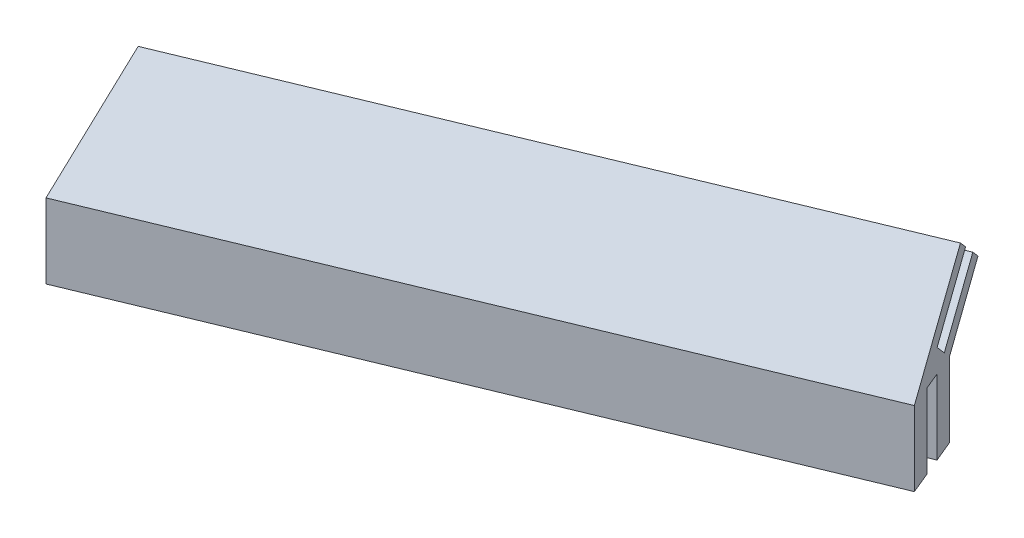
ISO-10303-21;
HEADER;
FILE_DESCRIPTION(('STEP AP214'),'2;1');
FILE_NAME('part.step','',(''),(''),'','','');
FILE_SCHEMA(('AUTOMOTIVE_DESIGN { 1 0 10303 214 1 1 1 1 }'));
ENDSEC;
DATA;
#1=APPLICATION_CONTEXT('core data for automotive mechanical design processes');
#2=APPLICATION_PROTOCOL_DEFINITION('international standard','automotive_design',2000,#1);
#3=PRODUCT_CONTEXT('',#1,'mechanical');
#4=PRODUCT('Part','Part','',(#3));
#5=PRODUCT_RELATED_PRODUCT_CATEGORY('part','',(#4));
#6=PRODUCT_DEFINITION_FORMATION('','',#4);
#7=PRODUCT_DEFINITION_CONTEXT('part definition',#1,'design');
#8=PRODUCT_DEFINITION('design','',#6,#7);
#9=PRODUCT_DEFINITION_SHAPE('','',#8);
#10=(LENGTH_UNIT() NAMED_UNIT(*) SI_UNIT(.MILLI.,.METRE.));
#11=(NAMED_UNIT(*) PLANE_ANGLE_UNIT() SI_UNIT($,.RADIAN.));
#12=(NAMED_UNIT(*) SI_UNIT($,.STERADIAN.) SOLID_ANGLE_UNIT());
#13=UNCERTAINTY_MEASURE_WITH_UNIT(LENGTH_MEASURE(1.E-05),#10,'distance_accuracy_value','');
#14=(GEOMETRIC_REPRESENTATION_CONTEXT(3) GLOBAL_UNCERTAINTY_ASSIGNED_CONTEXT((#13)) GLOBAL_UNIT_ASSIGNED_CONTEXT((#10,
#11,#12)) REPRESENTATION_CONTEXT('',''));
#15=CARTESIAN_POINT('',(0.,0.,0.));
#16=DIRECTION('',(0.,0.,1.));
#17=DIRECTION('',(1.,0.,0.));
#18=AXIS2_PLACEMENT_3D('',#15,#16,#17);
#19=CARTESIAN_POINT('',(-10.3545673524431,20.8540890912135,208.181611462975));
#20=DIRECTION('',(-0.270598050073099,-0.707106781186545,-0.65328148243819));
#21=DIRECTION('',(0.,0.678598344545849,-0.734509555267753));
#22=AXIS2_PLACEMENT_3D('',#19,#20,#21);
#23=PLANE('',#22);
#24=DIRECTION('',(0.,-0.678598344545849,0.734509555267754));
#25=VECTOR('',#24,1.);
#26=CARTESIAN_POINT('',(-2.22449580092777,23.8060509890975,201.618845029443));
#27=LINE('',#26,#25);
#28=CARTESIAN_POINT('',(-2.22449580092764,20.8540890912135,204.814025563273));
#29=VERTEX_POINT('',#28);
#30=CARTESIAN_POINT('',(-2.22449580092776,11.6617009357884,214.763794804766));
#31=VERTEX_POINT('',#30);
#32=EDGE_CURVE('E60',#29,#31,#27,.T.);
#33=ORIENTED_EDGE('',*,*,#32,.T.);
#34=DIRECTION('',(0.923879532511287,0.,-0.38268343236509));
#35=VECTOR('',#34,1.);
#36=CARTESIAN_POINT('',(-6.83679270149283,11.6617009357884,216.674270734671));
#37=LINE('',#36,#35);
#38=CARTESIAN_POINT('',(100.207968635436,11.6617009357884,172.334878807924));
#39=VERTEX_POINT('',#38);
#40=EDGE_CURVE('E245',#31,#39,#37,.T.);
#41=ORIENTED_EDGE('',*,*,#40,.T.);
#42=DIRECTION('',(-0.270598050073099,0.70710678118655,-0.653281482438186));
#43=VECTOR('',#42,1.);
#44=CARTESIAN_POINT('',(96.6901939844858,20.8540890912135,163.842219536228));
#45=LINE('',#44,#43);
#46=CARTESIAN_POINT('',(96.6901939844858,20.8540890912135,163.842219536228));
#47=VERTEX_POINT('',#46);
#48=EDGE_CURVE('E232',#39,#47,#45,.T.);
#49=ORIENTED_EDGE('',*,*,#48,.T.);
#50=DIRECTION('',(0.923879532511287,0.,-0.38268343236509));
#51=VECTOR('',#50,1.);
#52=CARTESIAN_POINT('',(-10.3545673524431,20.8540890912135,208.181611462975));
#53=LINE('',#52,#51);
#54=EDGE_CURVE('E55',#29,#47,#53,.T.);
#55=ORIENTED_EDGE('',*,*,#54,.F.);
#56=EDGE_LOOP('',(#33,#41,#49,#55));
#57=FACE_BOUND('',#56,.T.);
#58=ADVANCED_FACE('F39',(#57),#23,.F.);
#59=CARTESIAN_POINT('',(-6.83679270149283,11.6617009357884,216.674270734671));
#60=DIRECTION('',(0.270598050073097,-0.707106781186552,0.653281482438184));
#61=DIRECTION('',(0.,-0.678598344545842,-0.73450955526776));
#62=AXIS2_PLACEMENT_3D('',#59,#60,#61);
#63=PLANE('',#62);
#64=DIRECTION('',(-0.270598050073102,-0.707106781186543,-0.653281482438191));
#65=VECTOR('',#64,1.);
#66=CARTESIAN_POINT('',(-2.22449580092777,11.6617009357883,214.763794804766));
#67=LINE('',#66,#65);
#68=CARTESIAN_POINT('',(-1.33414524340857,13.9882990642116,216.913291195995));
#69=VERTEX_POINT('',#68);
#70=EDGE_CURVE('E332',#69,#31,#67,.T.);
#71=ORIENTED_EDGE('',*,*,#70,.F.);
#72=DIRECTION('',(0.923879532511287,0.,-0.38268343236509));
#73=VECTOR('',#72,1.);
#74=CARTESIAN_POINT('',(-5.94644214397365,13.9882990642116,218.8237671259));
#75=LINE('',#74,#73);
#76=CARTESIAN_POINT('',(101.098319192955,13.9882990642116,174.484375199153));
#77=VERTEX_POINT('',#76);
#78=EDGE_CURVE('E149',#69,#77,#75,.T.);
#79=ORIENTED_EDGE('',*,*,#78,.T.);
#80=DIRECTION('',(-0.270598050073096,-0.707106781186543,-0.653281482438195));
#81=VECTOR('',#80,1.);
#82=CARTESIAN_POINT('',(100.207968635436,11.6617009357884,172.334878807924));
#83=LINE('',#82,#81);
#84=EDGE_CURVE('E228',#77,#39,#83,.T.);
#85=ORIENTED_EDGE('',*,*,#84,.T.);
#86=ORIENTED_EDGE('',*,*,#40,.F.);
#87=EDGE_LOOP('',(#71,#79,#85,#86));
#88=FACE_BOUND('',#87,.T.);
#89=ADVANCED_FACE('F331',(#88),#63,.F.);
#90=CARTESIAN_POINT('',(-5.94644214397365,13.9882990642116,218.8237671259));
#91=DIRECTION('',(0.270598050073099,0.707106781186547,0.653281482438189));
#92=DIRECTION('',(0.,-0.678598344545848,0.734509555267755));
#93=AXIS2_PLACEMENT_3D('',#90,#91,#92);
#94=PLANE('',#93);
#95=DIRECTION('',(0.,-0.678598344545849,0.734509555267754));
#96=VECTOR('',#95,1.);
#97=CARTESIAN_POINT('',(-1.33414524340857,26.1326491175207,203.768341420673));
#98=LINE('',#97,#96);
#99=CARTESIAN_POINT('',(-1.33414524340857,23.1806872196367,206.963521954503));
#100=VERTEX_POINT('',#99);
#101=EDGE_CURVE('E154',#100,#69,#98,.T.);
#102=ORIENTED_EDGE('',*,*,#101,.F.);
#103=DIRECTION('',(0.923879532511287,0.,-0.38268343236509));
#104=VECTOR('',#103,1.);
#105=CARTESIAN_POINT('',(-9.46421679492393,23.1806872196367,210.331107854204));
#106=LINE('',#105,#104);
#107=CARTESIAN_POINT('',(97.580544542005,23.1806872196367,165.991715927457));
#108=VERTEX_POINT('',#107);
#109=EDGE_CURVE('E138',#100,#108,#106,.T.);
#110=ORIENTED_EDGE('',*,*,#109,.T.);
#111=DIRECTION('',(0.270598050073098,-0.707106781186548,0.653281482438188));
#112=VECTOR('',#111,1.);
#113=CARTESIAN_POINT('',(101.098319192955,13.9882990642116,174.484375199153));
#114=LINE('',#113,#112);
#115=EDGE_CURVE('E225',#108,#77,#114,.T.);
#116=ORIENTED_EDGE('',*,*,#115,.T.);
#117=ORIENTED_EDGE('',*,*,#78,.F.);
#118=EDGE_LOOP('',(#102,#110,#116,#117));
#119=FACE_BOUND('',#118,.T.);
#120=ADVANCED_FACE('F155',(#119),#94,.F.);
#121=CARTESIAN_POINT('',(-13.972297336363,38.284271247462,187.216606807487));
#122=DIRECTION('',(0.2705980500731,0.707106781186546,0.653281482438189));
#123=DIRECTION('',(0.,-0.678598344545848,0.734509555267754));
#124=AXIS2_PLACEMENT_3D('',#121,#122,#123);
#125=PLANE('',#124);
#126=DIRECTION('',(0.,0.678598344545848,-0.734509555267754));
#127=VECTOR('',#126,1.);
#128=CARTESIAN_POINT('',(-3.14837533343908,-8.0485775527046,232.883505674435));
#129=LINE('',#128,#127);
#130=CARTESIAN_POINT('',(-3.14837533343908,10.,213.347866105015));
#131=VERTEX_POINT('',#130);
#132=CARTESIAN_POINT('',(-3.14837533343908,19.1923881554251,203.398096863522));
#133=VERTEX_POINT('',#132);
#134=EDGE_CURVE('E259',#131,#133,#129,.T.);
#135=ORIENTED_EDGE('',*,*,#134,.T.);
#136=DIRECTION('',(0.923879532511287,0.,-0.38268343236509));
#137=VECTOR('',#136,1.);
#138=CARTESIAN_POINT('',(-10.9904727701149,19.1923881554251,206.646399979245));
#139=LINE('',#138,#137);
#140=CARTESIAN_POINT('',(96.054288566814,19.1923881554251,162.307008052498));
#141=VERTEX_POINT('',#140);
#142=EDGE_CURVE('E238',#133,#141,#139,.T.);
#143=ORIENTED_EDGE('',*,*,#142,.T.);
#144=DIRECTION('',(0.270598050073098,-0.707106781186549,0.653281482438187));
#145=VECTOR('',#144,1.);
#146=CARTESIAN_POINT('',(88.7481412148404,38.284271247462,144.668408026667));
#147=LINE('',#146,#145);
#148=CARTESIAN_POINT('',(99.5720632177643,10.,170.799667324194));
#149=VERTEX_POINT('',#148);
#150=EDGE_CURVE('E277',#141,#149,#147,.T.);
#151=ORIENTED_EDGE('',*,*,#150,.T.);
#152=DIRECTION('',(-0.923879532511287,0.,0.382683432365091));
#153=VECTOR('',#152,1.);
#154=CARTESIAN_POINT('',(-3.14837533343908,10.,213.347866105015));
#155=LINE('',#154,#153);
#156=EDGE_CURVE('E266',#149,#131,#155,.T.);
#157=ORIENTED_EDGE('',*,*,#156,.T.);
#158=EDGE_LOOP('',(#135,#143,#151,#157));
#159=FACE_BOUND('',#158,.T.);
#160=ADVANCED_FACE('F326',(#159),#125,.F.);
#161=CARTESIAN_POINT('',(93.0724640005659,38.284271247462,155.108246744044));
#162=DIRECTION('',(-0.270598050073099,-0.707106781186546,-0.653281482438189));
#163=DIRECTION('',(0.,0.678598344545848,-0.734509555267754));
#164=AXIS2_PLACEMENT_3D('',#161,#162,#163);
#165=PLANE('',#164);
#166=DIRECTION('',(0.270598050073098,-0.707106781186549,0.653281482438187));
#167=VECTOR('',#166,1.);
#168=CARTESIAN_POINT('',(93.0724640005659,38.284271247462,155.108246744044));
#169=LINE('',#168,#167);
#170=CARTESIAN_POINT('',(98.2164499596768,24.8423881554251,167.526927411187));
#171=VERTEX_POINT('',#170);
#172=CARTESIAN_POINT('',(103.89638600349,10.,181.239506041572));
#173=VERTEX_POINT('',#172);
#174=EDGE_CURVE('E281',#171,#173,#169,.T.);
#175=ORIENTED_EDGE('',*,*,#174,.F.);
#176=DIRECTION('',(0.923879532511287,0.,-0.38268343236509));
#177=VECTOR('',#176,1.);
#178=CARTESIAN_POINT('',(-8.82831137725214,24.8423881554251,211.866319337934));
#179=LINE('',#178,#177);
#180=CARTESIAN_POINT('',(-3.14837533343908,24.8423881554251,209.513612795174));
#181=VERTEX_POINT('',#180);
#182=EDGE_CURVE('E150',#181,#171,#179,.T.);
#183=ORIENTED_EDGE('',*,*,#182,.F.);
#184=DIRECTION('',(0.,-0.678598344545848,0.734509555267754));
#185=VECTOR('',#184,1.);
#186=CARTESIAN_POINT('',(-3.14837533343908,-5.16386609532728,241.992148356179));
#187=LINE('',#186,#185);
#188=CARTESIAN_POINT('',(-3.14837533343908,10.,225.578897968319));
#189=VERTEX_POINT('',#188);
#190=EDGE_CURVE('E262',#181,#189,#187,.T.);
#191=ORIENTED_EDGE('',*,*,#190,.T.);
#192=DIRECTION('',(0.923879532511287,0.,-0.38268343236509));
#193=VECTOR('',#192,1.);
#194=CARTESIAN_POINT('',(103.89638600349,10.,181.239506041572));
#195=LINE('',#194,#193);
#196=EDGE_CURVE('E273',#189,#173,#195,.T.);
#197=ORIENTED_EDGE('',*,*,#196,.T.);
#198=EDGE_LOOP('',(#175,#183,#191,#197));
#199=FACE_BOUND('',#198,.T.);
#200=ADVANCED_FACE('F296',(#199),#165,.F.);
#201=CARTESIAN_POINT('',(-3.14837533343908,0.,225.578897968319));
#202=DIRECTION('',(1.,0.,0.));
#203=DIRECTION('',(0.,0.,-1.));
#204=AXIS2_PLACEMENT_3D('',#201,#202,#203);
#205=PLANE('',#204);
#206=ORIENTED_EDGE('',*,*,#190,.F.);
#207=DIRECTION('',(0.,-0.67859834454584,-0.734509555267762));
#208=VECTOR('',#207,1.);
#209=CARTESIAN_POINT('',(-3.14837533343908,21.4101069395948,205.79853837795));
#210=LINE('',#209,#208);
#211=EDGE_CURVE('E242',#181,#133,#210,.T.);
#212=ORIENTED_EDGE('',*,*,#211,.T.);
#213=ORIENTED_EDGE('',*,*,#134,.F.);
#214=DIRECTION('',(0.,1.,0.));
#215=VECTOR('',#214,1.);
#216=CARTESIAN_POINT('',(-3.14837533343908,0.,213.347866105015));
#217=LINE('',#216,#215);
#218=CARTESIAN_POINT('',(-3.14837533343908,-3.,213.347866105015));
#219=VERTEX_POINT('',#218);
#220=EDGE_CURVE('E255',#219,#131,#217,.T.);
#221=ORIENTED_EDGE('',*,*,#220,.F.);
#222=DIRECTION('',(0.,0.,1.));
#223=VECTOR('',#222,1.);
#224=CARTESIAN_POINT('',(-3.14837533343908,-3.00000000000016,225.578897968319));
#225=LINE('',#224,#223);
#226=CARTESIAN_POINT('',(-3.14837533343908,-3.00000000000006,217.677434906184));
#227=VERTEX_POINT('',#226);
#228=EDGE_CURVE('E189',#219,#227,#225,.T.);
#229=ORIENTED_EDGE('',*,*,#228,.T.);
#230=DIRECTION('',(0.,1.,0.));
#231=VECTOR('',#230,1.);
#232=CARTESIAN_POINT('',(-3.14837533343908,0.,217.677434906184));
#233=LINE('',#232,#231);
#234=CARTESIAN_POINT('',(-3.14837533343908,10.,217.677434906184));
#235=VERTEX_POINT('',#234);
#236=EDGE_CURVE('E211',#227,#235,#233,.T.);
#237=ORIENTED_EDGE('',*,*,#236,.T.);
#238=DIRECTION('',(0.,0.,1.));
#239=VECTOR('',#238,1.);
#240=CARTESIAN_POINT('',(-3.14837533343908,10.,225.578897968319));
#241=LINE('',#240,#239);
#242=CARTESIAN_POINT('',(-3.14837533343908,10.,221.249329167149));
#243=VERTEX_POINT('',#242);
#244=EDGE_CURVE('E215',#235,#243,#241,.T.);
#245=ORIENTED_EDGE('',*,*,#244,.T.);
#246=DIRECTION('',(0.,-1.,0.));
#247=VECTOR('',#246,1.);
#248=CARTESIAN_POINT('',(-3.14837533343908,0.,221.249329167149));
#249=LINE('',#248,#247);
#250=CARTESIAN_POINT('',(-3.14837533343907,-2.99999999999994,221.249329167149));
#251=VERTEX_POINT('',#250);
#252=EDGE_CURVE('E219',#243,#251,#249,.T.);
#253=ORIENTED_EDGE('',*,*,#252,.T.);
#254=DIRECTION('',(0.,0.,1.));
#255=VECTOR('',#254,1.);
#256=CARTESIAN_POINT('',(-3.14837533343908,-3.,225.578897968319));
#257=LINE('',#256,#255);
#258=CARTESIAN_POINT('',(-3.14837533343919,-3.,225.578897968319));
#259=VERTEX_POINT('',#258);
#260=EDGE_CURVE('E207',#251,#259,#257,.T.);
#261=ORIENTED_EDGE('',*,*,#260,.T.);
#262=DIRECTION('',(0.,1.,0.));
#263=VECTOR('',#262,1.);
#264=CARTESIAN_POINT('',(-3.14837533343908,0.,225.578897968319));
#265=LINE('',#264,#263);
#266=EDGE_CURVE('E11',#259,#189,#265,.T.);
#267=ORIENTED_EDGE('',*,*,#266,.T.);
#268=EDGE_LOOP('',(#206,#212,#213,#221,#229,#237,#245,#253,#261,#267));
#269=FACE_BOUND('',#268,.T.);
#270=ADVANCED_FACE('F41',(#269),#205,.F.);
#271=CARTESIAN_POINT('',(103.89638600349,0.,181.239506041572));
#272=DIRECTION('',(-0.923879532511287,0.,0.38268343236509));
#273=DIRECTION('',(0.38268343236509,0.,0.923879532511287));
#274=AXIS2_PLACEMENT_3D('',#271,#272,#273);
#275=PLANE('',#274);
#276=DIRECTION('',(0.,1.,0.));
#277=VECTOR('',#276,1.);
#278=CARTESIAN_POINT('',(103.89638600349,0.,181.239506041572));
#279=LINE('',#278,#277);
#280=CARTESIAN_POINT('',(103.89638600349,-3.,181.239506041572));
#281=VERTEX_POINT('',#280);
#282=EDGE_CURVE('E48',#281,#173,#279,.T.);
#283=ORIENTED_EDGE('',*,*,#282,.F.);
#284=DIRECTION('',(0.38268343236509,0.,0.923879532511287));
#285=VECTOR('',#284,1.);
#286=CARTESIAN_POINT('',(103.89638600349,-3.,181.239506041572));
#287=LINE('',#286,#285);
#288=CARTESIAN_POINT('',(102.365652274029,-2.99999999999994,177.543987911526));
#289=VERTEX_POINT('',#288);
#290=EDGE_CURVE('E181',#289,#281,#287,.T.);
#291=ORIENTED_EDGE('',*,*,#290,.F.);
#292=DIRECTION('',(0.,-1.,0.));
#293=VECTOR('',#292,1.);
#294=CARTESIAN_POINT('',(102.365652274029,-2.99999999999994,177.543987911526));
#295=LINE('',#294,#293);
#296=CARTESIAN_POINT('',(102.365652274029,10.,177.543987911526));
#297=VERTEX_POINT('',#296);
#298=EDGE_CURVE('E177',#297,#289,#295,.T.);
#299=ORIENTED_EDGE('',*,*,#298,.F.);
#300=DIRECTION('',(0.382683432365091,0.,0.923879532511286));
#301=VECTOR('',#300,1.);
#302=CARTESIAN_POINT('',(102.365652274029,10.,177.543987911526));
#303=LINE('',#302,#301);
#304=CARTESIAN_POINT('',(101.102796947225,10.,174.495185454239));
#305=VERTEX_POINT('',#304);
#306=EDGE_CURVE('E173',#305,#297,#303,.T.);
#307=ORIENTED_EDGE('',*,*,#306,.F.);
#308=DIRECTION('',(0.,1.,0.));
#309=VECTOR('',#308,1.);
#310=CARTESIAN_POINT('',(101.102796947225,10.,174.495185454239));
#311=LINE('',#310,#309);
#312=CARTESIAN_POINT('',(101.102796947225,-3.00000000000006,174.495185454239));
#313=VERTEX_POINT('',#312);
#314=EDGE_CURVE('E166',#313,#305,#311,.T.);
#315=ORIENTED_EDGE('',*,*,#314,.F.);
#316=DIRECTION('',(0.38268343236509,0.,0.923879532511287));
#317=VECTOR('',#316,1.);
#318=CARTESIAN_POINT('',(101.102796947225,-3.00000000000006,174.495185454239));
#319=LINE('',#318,#317);
#320=CARTESIAN_POINT('',(99.5720632177643,-3.,170.799667324194));
#321=VERTEX_POINT('',#320);
#322=EDGE_CURVE('E162',#321,#313,#319,.T.);
#323=ORIENTED_EDGE('',*,*,#322,.F.);
#324=DIRECTION('',(0.,1.,0.));
#325=VECTOR('',#324,1.);
#326=CARTESIAN_POINT('',(99.5720632177643,0.,170.799667324194));
#327=LINE('',#326,#325);
#328=EDGE_CURVE('E256',#321,#149,#327,.T.);
#329=ORIENTED_EDGE('',*,*,#328,.T.);
#330=ORIENTED_EDGE('',*,*,#150,.F.);
#331=DIRECTION('',(-0.270598050073102,-0.707106781186541,-0.653281482438194));
#332=VECTOR('',#331,1.);
#333=CARTESIAN_POINT('',(96.054288566814,19.1923881554251,162.307008052498));
#334=LINE('',#333,#332);
#335=EDGE_CURVE('E235',#47,#141,#334,.T.);
#336=ORIENTED_EDGE('',*,*,#335,.F.);
#337=ORIENTED_EDGE('',*,*,#48,.F.);
#338=ORIENTED_EDGE('',*,*,#84,.F.);
#339=ORIENTED_EDGE('',*,*,#115,.F.);
#340=DIRECTION('',(-0.270598050073102,-0.707106781186541,-0.653281482438194));
#341=VECTOR('',#340,1.);
#342=CARTESIAN_POINT('',(97.580544542005,23.1806872196367,165.991715927457));
#343=LINE('',#342,#341);
#344=EDGE_CURVE('E144',#171,#108,#343,.T.);
#345=ORIENTED_EDGE('',*,*,#344,.F.);
#346=ORIENTED_EDGE('',*,*,#174,.T.);
#347=EDGE_LOOP('',(#283,#291,#299,#307,#315,#323,#329,#330,#336,#337,#338,#339,#345,#346));
#348=FACE_BOUND('',#347,.T.);
#349=ADVANCED_FACE('F293',(#348),#275,.F.);
#350=CARTESIAN_POINT('',(-3.14837533343908,0.,225.578897968319));
#351=DIRECTION('',(-0.382683432365091,0.,-0.923879532511287));
#352=DIRECTION('',(-0.923879532511287,0.,0.382683432365091));
#353=AXIS2_PLACEMENT_3D('',#350,#351,#352);
#354=PLANE('',#353);
#355=ORIENTED_EDGE('',*,*,#266,.F.);
#356=DIRECTION('',(0.923879532511287,0.,-0.38268343236509));
#357=VECTOR('',#356,1.);
#358=CARTESIAN_POINT('',(-3.14837533343919,-3.,225.578897968319));
#359=LINE('',#358,#357);
#360=EDGE_CURVE('E185',#259,#281,#359,.T.);
#361=ORIENTED_EDGE('',*,*,#360,.T.);
#362=ORIENTED_EDGE('',*,*,#282,.T.);
#363=ORIENTED_EDGE('',*,*,#196,.F.);
#364=EDGE_LOOP('',(#355,#361,#362,#363));
#365=FACE_BOUND('',#364,.T.);
#366=ADVANCED_FACE('F289',(#365),#354,.F.);
#367=CARTESIAN_POINT('',(-3.14837533343908,0.,213.347866105015));
#368=DIRECTION('',(0.382683432365091,0.,0.923879532511287));
#369=DIRECTION('',(0.923879532511287,0.,-0.382683432365091));
#370=AXIS2_PLACEMENT_3D('',#367,#368,#369);
#371=PLANE('',#370);
#372=ORIENTED_EDGE('',*,*,#328,.F.);
#373=DIRECTION('',(0.923879532511287,0.,-0.38268343236509));
#374=VECTOR('',#373,1.);
#375=CARTESIAN_POINT('',(-7.47269811916468,-3.,215.139059250941));
#376=LINE('',#375,#374);
#377=EDGE_CURVE('E184',#219,#321,#376,.T.);
#378=ORIENTED_EDGE('',*,*,#377,.F.);
#379=ORIENTED_EDGE('',*,*,#220,.T.);
#380=ORIENTED_EDGE('',*,*,#156,.F.);
#381=EDGE_LOOP('',(#372,#378,#379,#380));
#382=FACE_BOUND('',#381,.T.);
#383=ADVANCED_FACE('F323',(#382),#371,.F.);
#384=CARTESIAN_POINT('',(-10.9904727701149,19.1923881554251,206.646399979245));
#385=DIRECTION('',(0.270598050073096,-0.707106781186554,0.653281482438182));
#386=DIRECTION('',(0.,-0.67859834454584,-0.734509555267762));
#387=AXIS2_PLACEMENT_3D('',#384,#385,#386);
#388=PLANE('',#387);
#389=ORIENTED_EDGE('',*,*,#211,.F.);
#390=ORIENTED_EDGE('',*,*,#182,.T.);
#391=ORIENTED_EDGE('',*,*,#344,.T.);
#392=ORIENTED_EDGE('',*,*,#109,.F.);
#393=DIRECTION('',(0.270598050073102,0.707106781186541,0.653281482438194));
#394=VECTOR('',#393,1.);
#395=CARTESIAN_POINT('',(-2.22449580092777,20.8540890912135,204.814025563273));
#396=LINE('',#395,#394);
#397=EDGE_CURVE('E142',#29,#100,#396,.T.);
#398=ORIENTED_EDGE('',*,*,#397,.F.);
#399=ORIENTED_EDGE('',*,*,#54,.T.);
#400=ORIENTED_EDGE('',*,*,#335,.T.);
#401=ORIENTED_EDGE('',*,*,#142,.F.);
#402=EDGE_LOOP('',(#389,#390,#391,#392,#398,#399,#400,#401));
#403=FACE_BOUND('',#402,.T.);
#404=ADVANCED_FACE('F140',(#403),#388,.F.);
#405=CARTESIAN_POINT('',(-4.67910906289955,-2.99999999999994,221.883379838273));
#406=DIRECTION('',(0.38268343236509,0.,0.923879532511287));
#407=DIRECTION('',(0.923879532511287,0.,-0.38268343236509));
#408=AXIS2_PLACEMENT_3D('',#405,#406,#407);
#409=PLANE('',#408);
#410=DIRECTION('',(0.923879532511287,0.,-0.38268343236509));
#411=VECTOR('',#410,1.);
#412=CARTESIAN_POINT('',(-4.67910906289955,10.,221.883379838273));
#413=LINE('',#412,#411);
#414=EDGE_CURVE('E193',#243,#297,#413,.T.);
#415=ORIENTED_EDGE('',*,*,#414,.T.);
#416=ORIENTED_EDGE('',*,*,#298,.T.);
#417=DIRECTION('',(0.923879532511287,0.,-0.38268343236509));
#418=VECTOR('',#417,1.);
#419=CARTESIAN_POINT('',(-4.67910906289955,-2.99999999999994,221.883379838273));
#420=LINE('',#419,#418);
#421=EDGE_CURVE('E190',#251,#289,#420,.T.);
#422=ORIENTED_EDGE('',*,*,#421,.F.);
#423=ORIENTED_EDGE('',*,*,#252,.F.);
#424=EDGE_LOOP('',(#415,#416,#422,#423));
#425=FACE_BOUND('',#424,.T.);
#426=ADVANCED_FACE('F304',(#425),#409,.F.);
#427=CARTESIAN_POINT('',(-4.67910906289955,10.,221.883379838273));
#428=DIRECTION('',(0.,1.,0.));
#429=DIRECTION('',(0.,0.,1.));
#430=AXIS2_PLACEMENT_3D('',#427,#428,#429);
#431=PLANE('',#430);
#432=DIRECTION('',(0.923879532511287,0.,-0.38268343236509));
#433=VECTOR('',#432,1.);
#434=CARTESIAN_POINT('',(-5.94196438970432,10.,218.834577380986));
#435=LINE('',#434,#433);
#436=EDGE_CURVE('E196',#235,#305,#435,.T.);
#437=ORIENTED_EDGE('',*,*,#436,.T.);
#438=ORIENTED_EDGE('',*,*,#306,.T.);
#439=ORIENTED_EDGE('',*,*,#414,.F.);
#440=ORIENTED_EDGE('',*,*,#244,.F.);
#441=EDGE_LOOP('',(#437,#438,#439,#440));
#442=FACE_BOUND('',#441,.T.);
#443=ADVANCED_FACE('F311',(#442),#431,.F.);
#444=CARTESIAN_POINT('',(-5.94196438970432,10.,218.834577380986));
#445=DIRECTION('',(-0.38268343236509,0.,-0.923879532511287));
#446=DIRECTION('',(-0.923879532511287,0.,0.38268343236509));
#447=AXIS2_PLACEMENT_3D('',#444,#445,#446);
#448=PLANE('',#447);
#449=DIRECTION('',(0.923879532511287,0.,-0.38268343236509));
#450=VECTOR('',#449,1.);
#451=CARTESIAN_POINT('',(-5.94196438970432,-3.00000000000006,218.834577380986));
#452=LINE('',#451,#450);
#453=EDGE_CURVE('E199',#227,#313,#452,.T.);
#454=ORIENTED_EDGE('',*,*,#453,.T.);
#455=ORIENTED_EDGE('',*,*,#314,.T.);
#456=ORIENTED_EDGE('',*,*,#436,.F.);
#457=ORIENTED_EDGE('',*,*,#236,.F.);
#458=EDGE_LOOP('',(#454,#455,#456,#457));
#459=FACE_BOUND('',#458,.T.);
#460=ADVANCED_FACE('F314',(#459),#448,.F.);
#461=CARTESIAN_POINT('',(-3.14837533343919,-3.,225.578897968319));
#462=DIRECTION('',(0.,1.,0.));
#463=DIRECTION('',(0.,0.,1.));
#464=AXIS2_PLACEMENT_3D('',#461,#462,#463);
#465=PLANE('',#464);
#466=ORIENTED_EDGE('',*,*,#421,.T.);
#467=ORIENTED_EDGE('',*,*,#290,.T.);
#468=ORIENTED_EDGE('',*,*,#360,.F.);
#469=ORIENTED_EDGE('',*,*,#260,.F.);
#470=EDGE_LOOP('',(#466,#467,#468,#469));
#471=FACE_BOUND('',#470,.T.);
#472=ADVANCED_FACE('F302',(#471),#465,.F.);
#473=CARTESIAN_POINT('',(-5.94196438970432,-3.00000000000006,218.834577380986));
#474=DIRECTION('',(0.,1.,0.));
#475=DIRECTION('',(0.,0.,1.));
#476=AXIS2_PLACEMENT_3D('',#473,#474,#475);
#477=PLANE('',#476);
#478=ORIENTED_EDGE('',*,*,#377,.T.);
#479=ORIENTED_EDGE('',*,*,#322,.T.);
#480=ORIENTED_EDGE('',*,*,#453,.F.);
#481=ORIENTED_EDGE('',*,*,#228,.F.);
#482=EDGE_LOOP('',(#478,#479,#480,#481));
#483=FACE_BOUND('',#482,.T.);
#484=ADVANCED_FACE('F317',(#483),#477,.F.);
#485=CARTESIAN_POINT('',(-2.22449580092777,23.8060509890975,201.618845029443));
#486=DIRECTION('',(-0.962692419881156,0.198756853415515,0.183627388816942));
#487=DIRECTION('',(-0.202194992907038,-0.979345283770399,0.));
#488=AXIS2_PLACEMENT_3D('',#485,#486,#487);
#489=PLANE('',#488);
#490=ORIENTED_EDGE('',*,*,#32,.F.);
#491=ORIENTED_EDGE('',*,*,#397,.T.);
#492=ORIENTED_EDGE('',*,*,#101,.T.);
#493=ORIENTED_EDGE('',*,*,#70,.T.);
#494=EDGE_LOOP('',(#490,#491,#492,#493));
#495=FACE_BOUND('',#494,.T.);
#496=ADVANCED_FACE('F160',(#495),#489,.F.);
#497=CLOSED_SHELL('',(#58,#89,#120,#160,#200,#270,#349,#366,#383,#404,#426,#443,#460,#472,#484,#496));
#498=MANIFOLD_SOLID_BREP('B2',#497);
#499=ADVANCED_BREP_SHAPE_REPRESENTATION('',(#18,#498),#14);
#500=SHAPE_DEFINITION_REPRESENTATION(#9,#499);
ENDSEC;
END-ISO-10303-21;
